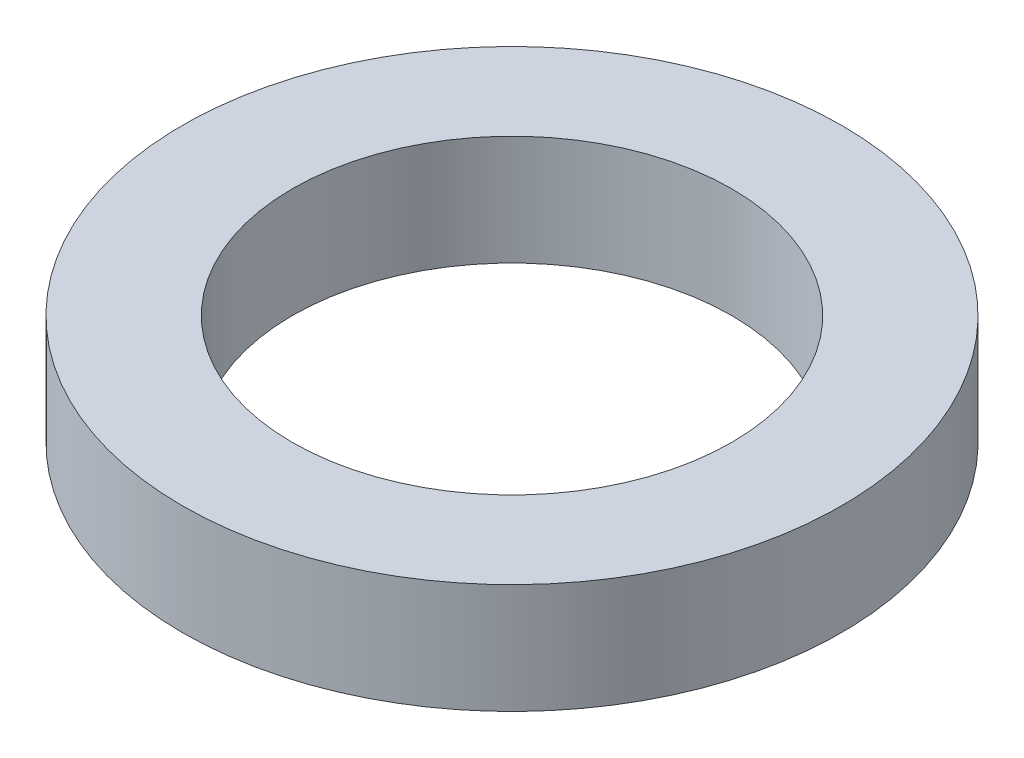
ISO-10303-21;
HEADER;
FILE_DESCRIPTION(('STEP AP214'),'2;1');
FILE_NAME('part.step','',(''),(''),'','','');
FILE_SCHEMA(('AUTOMOTIVE_DESIGN { 1 0 10303 214 1 1 1 1 }'));
ENDSEC;
DATA;
#1=APPLICATION_CONTEXT('core data for automotive mechanical design processes');
#2=APPLICATION_PROTOCOL_DEFINITION('international standard','automotive_design',2000,#1);
#3=PRODUCT_CONTEXT('',#1,'mechanical');
#4=PRODUCT('Part','Part','',(#3));
#5=PRODUCT_RELATED_PRODUCT_CATEGORY('part','',(#4));
#6=PRODUCT_DEFINITION_FORMATION('','',#4);
#7=PRODUCT_DEFINITION_CONTEXT('part definition',#1,'design');
#8=PRODUCT_DEFINITION('design','',#6,#7);
#9=PRODUCT_DEFINITION_SHAPE('','',#8);
#10=(LENGTH_UNIT() NAMED_UNIT(*) SI_UNIT(.MILLI.,.METRE.));
#11=(NAMED_UNIT(*) PLANE_ANGLE_UNIT() SI_UNIT($,.RADIAN.));
#12=(NAMED_UNIT(*) SI_UNIT($,.STERADIAN.) SOLID_ANGLE_UNIT());
#13=UNCERTAINTY_MEASURE_WITH_UNIT(LENGTH_MEASURE(1.E-05),#10,'distance_accuracy_value','');
#14=(GEOMETRIC_REPRESENTATION_CONTEXT(3) GLOBAL_UNCERTAINTY_ASSIGNED_CONTEXT((#13)) GLOBAL_UNIT_ASSIGNED_CONTEXT((#10,
#11,#12)) REPRESENTATION_CONTEXT('',''));
#15=CARTESIAN_POINT('',(0.,0.,0.));
#16=DIRECTION('',(0.,0.,1.));
#17=DIRECTION('',(1.,0.,0.));
#18=AXIS2_PLACEMENT_3D('',#15,#16,#17);
#19=CARTESIAN_POINT('',(0.,5.,0.));
#20=DIRECTION('',(0.,1.,0.));
#21=DIRECTION('',(0.,0.,1.));
#22=AXIS2_PLACEMENT_3D('',#19,#20,#21);
#23=PLANE('',#22);
#24=CARTESIAN_POINT('',(0.,5.,0.));
#25=DIRECTION('',(0.,1.,0.));
#26=DIRECTION('',(0.,0.,1.));
#27=AXIS2_PLACEMENT_3D('',#24,#25,#26);
#28=CIRCLE('',#27,15.);
#29=CARTESIAN_POINT('',(0.,5.,15.));
#30=VERTEX_POINT('',#29);
#31=EDGE_CURVE('E10',#30,#30,#28,.T.);
#32=ORIENTED_EDGE('',*,*,#31,.T.);
#33=EDGE_LOOP('',(#32));
#34=FACE_BOUND('',#33,.T.);
#35=CARTESIAN_POINT('',(0.,5.,0.));
#36=DIRECTION('',(0.,1.,0.));
#37=DIRECTION('',(0.,0.,1.));
#38=AXIS2_PLACEMENT_3D('',#35,#36,#37);
#39=CIRCLE('',#38,10.);
#40=CARTESIAN_POINT('',(0.,5.,10.));
#41=VERTEX_POINT('',#40);
#42=EDGE_CURVE('E41',#41,#41,#39,.T.);
#43=ORIENTED_EDGE('',*,*,#42,.F.);
#44=EDGE_LOOP('',(#43));
#45=FACE_BOUND('',#44,.T.);
#46=ADVANCED_FACE('F30',(#34,#45),#23,.T.);
#47=CARTESIAN_POINT('',(0.,0.,0.));
#48=DIRECTION('',(0.,1.,0.));
#49=DIRECTION('',(0.,0.,1.));
#50=AXIS2_PLACEMENT_3D('',#47,#48,#49);
#51=PLANE('',#50);
#52=CARTESIAN_POINT('',(0.,0.,0.));
#53=DIRECTION('',(0.,1.,0.));
#54=DIRECTION('',(0.,0.,1.));
#55=AXIS2_PLACEMENT_3D('',#52,#53,#54);
#56=CIRCLE('',#55,15.);
#57=CARTESIAN_POINT('',(0.,0.,15.));
#58=VERTEX_POINT('',#57);
#59=EDGE_CURVE('E34',#58,#58,#56,.T.);
#60=ORIENTED_EDGE('',*,*,#59,.F.);
#61=EDGE_LOOP('',(#60));
#62=FACE_BOUND('',#61,.T.);
#63=CARTESIAN_POINT('',(0.,0.,0.));
#64=DIRECTION('',(0.,1.,0.));
#65=DIRECTION('',(0.,0.,1.));
#66=AXIS2_PLACEMENT_3D('',#63,#64,#65);
#67=CIRCLE('',#66,10.);
#68=CARTESIAN_POINT('',(0.,0.,10.));
#69=VERTEX_POINT('',#68);
#70=EDGE_CURVE('E43',#69,#69,#67,.T.);
#71=ORIENTED_EDGE('',*,*,#70,.T.);
#72=EDGE_LOOP('',(#71));
#73=FACE_BOUND('',#72,.T.);
#74=ADVANCED_FACE('F53',(#62,#73),#51,.F.);
#75=CARTESIAN_POINT('',(0.,5.,0.));
#76=DIRECTION('',(0.,-1.,0.));
#77=DIRECTION('',(0.,0.,-1.));
#78=AXIS2_PLACEMENT_3D('',#75,#76,#77);
#79=CYLINDRICAL_SURFACE('',#78,15.);
#80=ORIENTED_EDGE('',*,*,#31,.F.);
#81=EDGE_LOOP('',(#80));
#82=FACE_BOUND('',#81,.T.);
#83=ORIENTED_EDGE('',*,*,#59,.T.);
#84=EDGE_LOOP('',(#83));
#85=FACE_BOUND('',#84,.T.);
#86=ADVANCED_FACE('F32',(#82,#85),#79,.T.);
#87=CARTESIAN_POINT('',(0.,5.,0.));
#88=DIRECTION('',(0.,-1.,0.));
#89=DIRECTION('',(0.,0.,-1.));
#90=AXIS2_PLACEMENT_3D('',#87,#88,#89);
#91=CYLINDRICAL_SURFACE('',#90,10.);
#92=ORIENTED_EDGE('',*,*,#42,.T.);
#93=EDGE_LOOP('',(#92));
#94=FACE_BOUND('',#93,.T.);
#95=ORIENTED_EDGE('',*,*,#70,.F.);
#96=EDGE_LOOP('',(#95));
#97=FACE_BOUND('',#96,.T.);
#98=ADVANCED_FACE('F49',(#94,#97),#91,.F.);
#99=CLOSED_SHELL('',(#46,#74,#86,#98));
#100=MANIFOLD_SOLID_BREP('B2',#99);
#101=ADVANCED_BREP_SHAPE_REPRESENTATION('',(#18,#100),#14);
#102=SHAPE_DEFINITION_REPRESENTATION(#9,#101);
ENDSEC;
END-ISO-10303-21;
